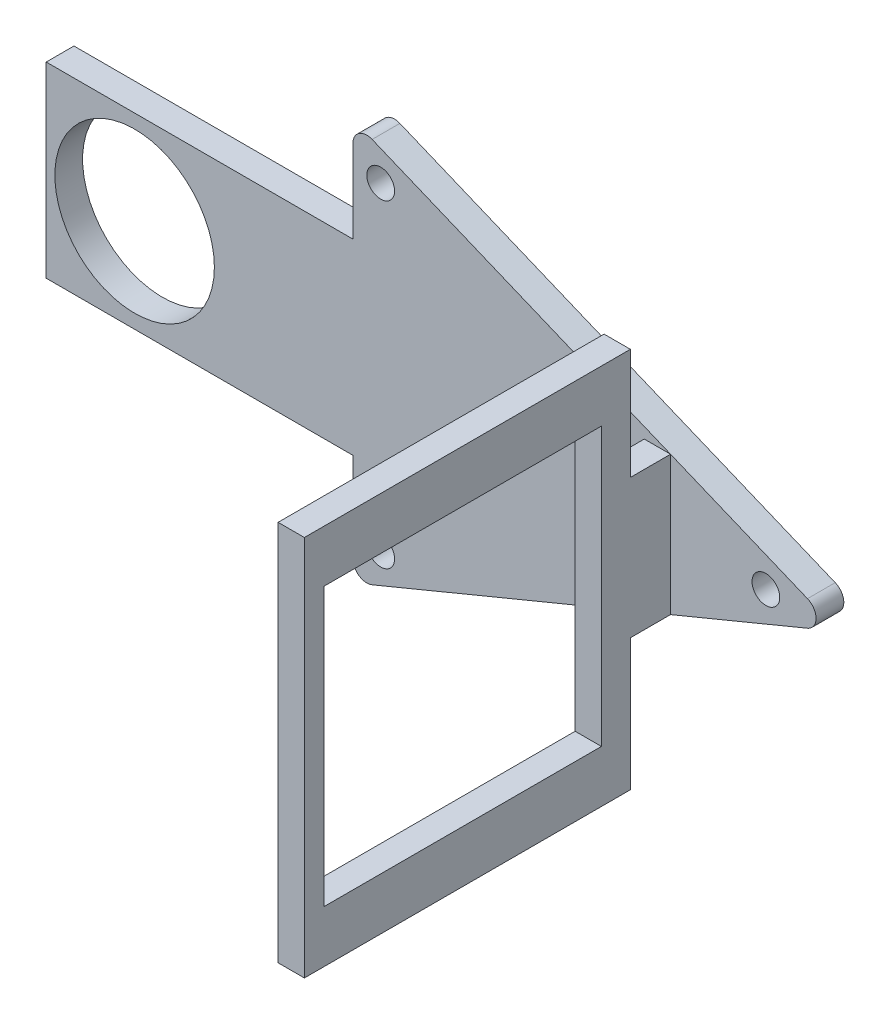
ISO-10303-21;
HEADER;
FILE_DESCRIPTION(('STEP AP214'),'2;1');
FILE_NAME('part.step','',(''),(''),'','','');
FILE_SCHEMA(('AUTOMOTIVE_DESIGN { 1 0 10303 214 1 1 1 1 }'));
ENDSEC;
DATA;
#1=APPLICATION_CONTEXT('core data for automotive mechanical design processes');
#2=APPLICATION_PROTOCOL_DEFINITION('international standard','automotive_design',2000,#1);
#3=PRODUCT_CONTEXT('',#1,'mechanical');
#4=PRODUCT('Part','Part','',(#3));
#5=PRODUCT_RELATED_PRODUCT_CATEGORY('part','',(#4));
#6=PRODUCT_DEFINITION_FORMATION('','',#4);
#7=PRODUCT_DEFINITION_CONTEXT('part definition',#1,'design');
#8=PRODUCT_DEFINITION('design','',#6,#7);
#9=PRODUCT_DEFINITION_SHAPE('','',#8);
#10=(LENGTH_UNIT() NAMED_UNIT(*) SI_UNIT(.MILLI.,.METRE.));
#11=(NAMED_UNIT(*) PLANE_ANGLE_UNIT() SI_UNIT($,.RADIAN.));
#12=(NAMED_UNIT(*) SI_UNIT($,.STERADIAN.) SOLID_ANGLE_UNIT());
#13=UNCERTAINTY_MEASURE_WITH_UNIT(LENGTH_MEASURE(1.E-05),#10,'distance_accuracy_value','');
#14=(GEOMETRIC_REPRESENTATION_CONTEXT(3) GLOBAL_UNCERTAINTY_ASSIGNED_CONTEXT((#13)) GLOBAL_UNIT_ASSIGNED_CONTEXT((#10,
#11,#12)) REPRESENTATION_CONTEXT('',''));
#15=CARTESIAN_POINT('',(0.,0.,0.));
#16=DIRECTION('',(0.,0.,1.));
#17=DIRECTION('',(1.,0.,0.));
#18=AXIS2_PLACEMENT_3D('',#15,#16,#17);
#19=CARTESIAN_POINT('',(14.8531855955679,-10.0113976186966,-0.002000000000002));
#20=DIRECTION('',(0.,-1.,0.));
#21=DIRECTION('',(0.,0.,-1.));
#22=AXIS2_PLACEMENT_3D('',#19,#20,#21);
#23=PLANE('',#22);
#24=DIRECTION('',(0.,0.,1.));
#25=VECTOR('',#24,1.);
#26=CARTESIAN_POINT('',(18.6438058994469,-10.0113976186966,-0.002000000000002));
#27=LINE('',#26,#25);
#28=CARTESIAN_POINT('',(18.6438058994469,-10.0113976186966,4.));
#29=VERTEX_POINT('',#28);
#30=CARTESIAN_POINT('',(18.6438058994469,-10.0113976186966,9.79265388740694));
#31=VERTEX_POINT('',#30);
#32=EDGE_CURVE('E258',#29,#31,#27,.T.);
#33=ORIENTED_EDGE('',*,*,#32,.T.);
#34=DIRECTION('',(1.,0.,0.));
#35=VECTOR('',#34,1.);
#36=CARTESIAN_POINT('',(18.6438058994469,-10.0113976186966,9.79265388740694));
#37=LINE('',#36,#35);
#38=CARTESIAN_POINT('',(14.8531855955679,-10.0113976186966,9.79265388740694));
#39=VERTEX_POINT('',#38);
#40=EDGE_CURVE('E207',#39,#31,#37,.T.);
#41=ORIENTED_EDGE('',*,*,#40,.F.);
#42=DIRECTION('',(0.,0.,1.));
#43=VECTOR('',#42,1.);
#44=CARTESIAN_POINT('',(14.8531855955679,-10.0113976186966,-0.002000000000002));
#45=LINE('',#44,#43);
#46=CARTESIAN_POINT('',(14.8531855955679,-10.0113976186966,4.));
#47=VERTEX_POINT('',#46);
#48=EDGE_CURVE('E250',#47,#39,#45,.T.);
#49=ORIENTED_EDGE('',*,*,#48,.F.);
#50=DIRECTION('',(-1.,0.,0.));
#51=VECTOR('',#50,1.);
#52=CARTESIAN_POINT('',(14.8531855955679,-10.0113976186966,4.));
#53=LINE('',#52,#51);
#54=EDGE_CURVE('E261',#29,#47,#53,.T.);
#55=ORIENTED_EDGE('',*,*,#54,.F.);
#56=EDGE_LOOP('',(#33,#41,#49,#55));
#57=FACE_BOUND('',#56,.T.);
#58=ADVANCED_FACE('F33',(#57),#23,.T.);
#59=CARTESIAN_POINT('',(18.6438058994469,10.0113976186967,-0.002000000000002));
#60=DIRECTION('',(0.,1.,0.));
#61=DIRECTION('',(0.,0.,1.));
#62=AXIS2_PLACEMENT_3D('',#59,#60,#61);
#63=PLANE('',#62);
#64=DIRECTION('',(0.,0.,1.));
#65=VECTOR('',#64,1.);
#66=CARTESIAN_POINT('',(14.8531855955679,10.0113976186967,-0.002000000000002));
#67=LINE('',#66,#65);
#68=CARTESIAN_POINT('',(14.8531855955679,10.0113976186967,4.));
#69=VERTEX_POINT('',#68);
#70=CARTESIAN_POINT('',(14.8531855955679,10.0113976186967,9.79265388740693));
#71=VERTEX_POINT('',#70);
#72=EDGE_CURVE('E253',#69,#71,#67,.T.);
#73=ORIENTED_EDGE('',*,*,#72,.T.);
#74=DIRECTION('',(-1.,0.,0.));
#75=VECTOR('',#74,1.);
#76=CARTESIAN_POINT('',(14.8531855955679,10.0113976186967,9.79265388740693));
#77=LINE('',#76,#75);
#78=CARTESIAN_POINT('',(18.6438058994469,10.0113976186967,9.79265388740693));
#79=VERTEX_POINT('',#78);
#80=EDGE_CURVE('E227',#79,#71,#77,.T.);
#81=ORIENTED_EDGE('',*,*,#80,.F.);
#82=DIRECTION('',(0.,0.,1.));
#83=VECTOR('',#82,1.);
#84=CARTESIAN_POINT('',(18.6438058994469,10.0113976186967,-0.002000000000002));
#85=LINE('',#84,#83);
#86=CARTESIAN_POINT('',(18.6438058994469,10.0113976186967,4.));
#87=VERTEX_POINT('',#86);
#88=EDGE_CURVE('E255',#87,#79,#85,.T.);
#89=ORIENTED_EDGE('',*,*,#88,.F.);
#90=DIRECTION('',(1.,0.,0.));
#91=VECTOR('',#90,1.);
#92=CARTESIAN_POINT('',(18.6438058994469,10.0113976186967,4.));
#93=LINE('',#92,#91);
#94=EDGE_CURVE('E266',#69,#87,#93,.T.);
#95=ORIENTED_EDGE('',*,*,#94,.F.);
#96=EDGE_LOOP('',(#73,#81,#89,#95));
#97=FACE_BOUND('',#96,.T.);
#98=ADVANCED_FACE('F460',(#97),#63,.T.);
#99=CARTESIAN_POINT('',(-25.1468144044321,25.9560362279846,4.));
#100=DIRECTION('',(0.,0.,1.));
#101=DIRECTION('',(1.,0.,0.));
#102=AXIS2_PLACEMENT_3D('',#99,#100,#101);
#103=PLANE('',#102);
#104=CARTESIAN_POINT('',(-23.1468144044321,-22.9647040349165,4.));
#105=DIRECTION('',(0.,0.,1.));
#106=DIRECTION('',(1.,0.,0.));
#107=AXIS2_PLACEMENT_3D('',#104,#105,#106);
#108=CIRCLE('',#107,1.99999999999998);
#109=CARTESIAN_POINT('',(-21.1468144044322,-22.9647040349165,4.));
#110=VERTEX_POINT('',#109);
#111=EDGE_CURVE('E381',#110,#110,#108,.T.);
#112=ORIENTED_EDGE('',*,*,#111,.F.);
#113=EDGE_LOOP('',(#112));
#114=FACE_BOUND('',#113,.T.);
#115=CARTESIAN_POINT('',(-23.1468144044321,22.9647040349165,4.));
#116=DIRECTION('',(0.,0.,1.));
#117=DIRECTION('',(1.,0.,0.));
#118=AXIS2_PLACEMENT_3D('',#115,#116,#117);
#119=CIRCLE('',#118,1.99999999999998);
#120=CARTESIAN_POINT('',(-21.1468144044322,22.9647040349165,4.));
#121=VERTEX_POINT('',#120);
#122=EDGE_CURVE('E375',#121,#121,#119,.T.);
#123=ORIENTED_EDGE('',*,*,#122,.F.);
#124=EDGE_LOOP('',(#123));
#125=FACE_BOUND('',#124,.T.);
#126=CARTESIAN_POINT('',(-58.625359309383,0.476036227984549,4.));
#127=DIRECTION('',(0.,0.,1.));
#128=DIRECTION('',(1.,0.,0.));
#129=AXIS2_PLACEMENT_3D('',#126,#127,#128);
#130=CIRCLE('',#129,11.5);
#131=CARTESIAN_POINT('',(-47.125359309383,0.476036227984549,4.));
#132=VERTEX_POINT('',#131);
#133=EDGE_CURVE('E364',#132,#132,#130,.T.);
#134=ORIENTED_EDGE('',*,*,#133,.F.);
#135=EDGE_LOOP('',(#134));
#136=FACE_BOUND('',#135,.T.);
#137=DIRECTION('',(0.92410145706241,0.382147219085959,0.));
#138=VECTOR('',#137,1.);
#139=CARTESIAN_POINT('',(-24.3825199662603,-27.8042391421093,4.));
#140=LINE('',#139,#138);
#141=CARTESIAN_POINT('',(-24.3825199662602,-27.8042391421094,4.));
#142=VERTEX_POINT('',#141);
#143=EDGE_CURVE('E328',#142,#29,#140,.T.);
#144=ORIENTED_EDGE('',*,*,#143,.T.);
#145=ORIENTED_EDGE('',*,*,#54,.T.);
#146=DIRECTION('',(0.,1.,0.));
#147=VECTOR('',#146,1.);
#148=CARTESIAN_POINT('',(14.8531855955679,10.0113976186967,4.));
#149=LINE('',#148,#147);
#150=EDGE_CURVE('E262',#47,#69,#149,.T.);
#151=ORIENTED_EDGE('',*,*,#150,.T.);
#152=ORIENTED_EDGE('',*,*,#94,.T.);
#153=DIRECTION('',(-0.92410145706241,0.382147219085958,0.));
#154=VECTOR('',#153,1.);
#155=CARTESIAN_POINT('',(38.3838949123206,1.84820291412484,4.));
#156=LINE('',#155,#154);
#157=CARTESIAN_POINT('',(-24.3825199662603,27.8042391421093,4.));
#158=VERTEX_POINT('',#157);
#159=EDGE_CURVE('E334',#87,#158,#156,.T.);
#160=ORIENTED_EDGE('',*,*,#159,.T.);
#161=CARTESIAN_POINT('',(-25.1468144044321,25.9560362279846,4.));
#162=DIRECTION('',(0.,0.,1.));
#163=DIRECTION('',(1.,0.,0.));
#164=AXIS2_PLACEMENT_3D('',#161,#162,#163);
#165=CIRCLE('',#164,1.99999999999999);
#166=CARTESIAN_POINT('',(-27.1468144044321,25.9560362279846,4.));
#167=VERTEX_POINT('',#166);
#168=EDGE_CURVE('E296',#158,#167,#165,.T.);
#169=ORIENTED_EDGE('',*,*,#168,.T.);
#170=DIRECTION('',(0.,-1.,0.));
#171=VECTOR('',#170,1.);
#172=CARTESIAN_POINT('',(-27.1468144044321,25.9560362279846,4.));
#173=LINE('',#172,#171);
#174=CARTESIAN_POINT('',(-27.1468144044321,13.9760362279845,4.));
#175=VERTEX_POINT('',#174);
#176=EDGE_CURVE('E321',#167,#175,#173,.T.);
#177=ORIENTED_EDGE('',*,*,#176,.T.);
#178=DIRECTION('',(1.,0.,0.));
#179=VECTOR('',#178,1.);
#180=CARTESIAN_POINT('',(-71.3681981861213,13.9760362279845,4.));
#181=LINE('',#180,#179);
#182=CARTESIAN_POINT('',(-71.3681981861213,13.9760362279845,4.));
#183=VERTEX_POINT('',#182);
#184=EDGE_CURVE('E284',#183,#175,#181,.T.);
#185=ORIENTED_EDGE('',*,*,#184,.F.);
#186=DIRECTION('',(0.,1.,0.));
#187=VECTOR('',#186,1.);
#188=CARTESIAN_POINT('',(-71.3681981861213,13.9760362279845,4.));
#189=LINE('',#188,#187);
#190=CARTESIAN_POINT('',(-71.3681981861213,-13.0239637720154,4.));
#191=VERTEX_POINT('',#190);
#192=EDGE_CURVE('E282',#191,#183,#189,.T.);
#193=ORIENTED_EDGE('',*,*,#192,.F.);
#194=DIRECTION('',(1.,0.,0.));
#195=VECTOR('',#194,1.);
#196=CARTESIAN_POINT('',(-71.3681981861213,-13.0239637720154,4.));
#197=LINE('',#196,#195);
#198=CARTESIAN_POINT('',(-27.1468144044321,-13.0239637720154,4.));
#199=VERTEX_POINT('',#198);
#200=EDGE_CURVE('E290',#191,#199,#197,.T.);
#201=ORIENTED_EDGE('',*,*,#200,.T.);
#202=CARTESIAN_POINT('',(-27.1468144044321,-25.9560362279846,4.));
#203=VERTEX_POINT('',#202);
#204=EDGE_CURVE('E320',#199,#203,#173,.T.);
#205=ORIENTED_EDGE('',*,*,#204,.T.);
#206=CARTESIAN_POINT('',(-25.1468144044321,-25.9560362279846,4.));
#207=DIRECTION('',(0.,0.,1.));
#208=DIRECTION('',(1.,0.,0.));
#209=AXIS2_PLACEMENT_3D('',#206,#207,#208);
#210=CIRCLE('',#209,1.99999999999999);
#211=EDGE_CURVE('E324',#203,#142,#210,.T.);
#212=ORIENTED_EDGE('',*,*,#211,.T.);
#213=EDGE_LOOP('',(#144,#145,#151,#152,#160,#169,#177,#185,#193,#201,#205,#212));
#214=FACE_BOUND('',#213,.T.);
#215=ADVANCED_FACE('F446',(#114,#125,#136,#214),#103,.T.);
#216=CARTESIAN_POINT('',(32.3860153527295,0.,4.));
#217=DIRECTION('',(0.,0.,1.));
#218=DIRECTION('',(1.,0.,0.));
#219=AXIS2_PLACEMENT_3D('',#216,#217,#218);
#220=CIRCLE('',#219,1.99999999999998);
#221=CARTESIAN_POINT('',(34.3860153527294,0.,4.));
#222=VERTEX_POINT('',#221);
#223=EDGE_CURVE('E369',#222,#222,#220,.T.);
#224=ORIENTED_EDGE('',*,*,#223,.F.);
#225=EDGE_LOOP('',(#224));
#226=FACE_BOUND('',#225,.T.);
#227=CARTESIAN_POINT('',(38.3838949123206,1.84820291412483,4.));
#228=VERTEX_POINT('',#227);
#229=EDGE_CURVE('E301',#228,#87,#156,.T.);
#230=ORIENTED_EDGE('',*,*,#229,.T.);
#231=DIRECTION('',(0.,-1.,0.));
#232=VECTOR('',#231,1.);
#233=CARTESIAN_POINT('',(18.6438058994469,-10.0113976186966,4.));
#234=LINE('',#233,#232);
#235=EDGE_CURVE('E269',#87,#29,#234,.T.);
#236=ORIENTED_EDGE('',*,*,#235,.T.);
#237=CARTESIAN_POINT('',(38.3838949123206,-1.84820291412479,4.));
#238=VERTEX_POINT('',#237);
#239=EDGE_CURVE('E327',#29,#238,#140,.T.);
#240=ORIENTED_EDGE('',*,*,#239,.T.);
#241=CARTESIAN_POINT('',(37.6196004741487,0.,4.));
#242=DIRECTION('',(0.,0.,1.));
#243=DIRECTION('',(1.,0.,0.));
#244=AXIS2_PLACEMENT_3D('',#241,#242,#243);
#245=CIRCLE('',#244,2.00000000000001);
#246=EDGE_CURVE('E331',#238,#228,#245,.T.);
#247=ORIENTED_EDGE('',*,*,#246,.T.);
#248=EDGE_LOOP('',(#230,#236,#240,#247));
#249=FACE_BOUND('',#248,.T.);
#250=ADVANCED_FACE('F448',(#226,#249),#103,.T.);
#251=CARTESIAN_POINT('',(-27.1468144044321,25.9560362279846,0.));
#252=DIRECTION('',(-1.,0.,0.));
#253=DIRECTION('',(0.,0.,1.));
#254=AXIS2_PLACEMENT_3D('',#251,#252,#253);
#255=PLANE('',#254);
#256=DIRECTION('',(0.,-1.,0.));
#257=VECTOR('',#256,1.);
#258=CARTESIAN_POINT('',(-27.1468144044321,25.9560362279846,0.));
#259=LINE('',#258,#257);
#260=CARTESIAN_POINT('',(-27.1468144044321,25.9560362279846,0.));
#261=VERTEX_POINT('',#260);
#262=CARTESIAN_POINT('',(-27.1468144044321,13.9760362279845,0.));
#263=VERTEX_POINT('',#262);
#264=EDGE_CURVE('E302',#261,#263,#259,.T.);
#265=ORIENTED_EDGE('',*,*,#264,.T.);
#266=DIRECTION('',(0.,0.,-1.));
#267=VECTOR('',#266,1.);
#268=CARTESIAN_POINT('',(-27.1468144044321,13.9760362279845,0.));
#269=LINE('',#268,#267);
#270=EDGE_CURVE('E265',#175,#263,#269,.T.);
#271=ORIENTED_EDGE('',*,*,#270,.F.);
#272=ORIENTED_EDGE('',*,*,#176,.F.);
#273=DIRECTION('',(0.,0.,1.));
#274=VECTOR('',#273,1.);
#275=CARTESIAN_POINT('',(-27.1468144044321,25.9560362279846,0.));
#276=LINE('',#275,#274);
#277=EDGE_CURVE('E317',#261,#167,#276,.T.);
#278=ORIENTED_EDGE('',*,*,#277,.F.);
#279=EDGE_LOOP('',(#265,#271,#272,#278));
#280=FACE_BOUND('',#279,.T.);
#281=ADVANCED_FACE('F444',(#280),#255,.T.);
#282=ORIENTED_EDGE('',*,*,#204,.F.);
#283=DIRECTION('',(0.,0.,1.));
#284=VECTOR('',#283,1.);
#285=CARTESIAN_POINT('',(-27.1468144044321,-13.0239637720154,4.));
#286=LINE('',#285,#284);
#287=CARTESIAN_POINT('',(-27.1468144044321,-13.0239637720154,0.));
#288=VERTEX_POINT('',#287);
#289=EDGE_CURVE('E278',#288,#199,#286,.T.);
#290=ORIENTED_EDGE('',*,*,#289,.F.);
#291=CARTESIAN_POINT('',(-27.1468144044321,-25.9560362279846,0.));
#292=VERTEX_POINT('',#291);
#293=EDGE_CURVE('E300',#288,#292,#259,.T.);
#294=ORIENTED_EDGE('',*,*,#293,.T.);
#295=DIRECTION('',(0.,0.,1.));
#296=VECTOR('',#295,1.);
#297=CARTESIAN_POINT('',(-27.1468144044321,-25.9560362279846,0.));
#298=LINE('',#297,#296);
#299=EDGE_CURVE('E348',#292,#203,#298,.T.);
#300=ORIENTED_EDGE('',*,*,#299,.T.);
#301=EDGE_LOOP('',(#282,#290,#294,#300));
#302=FACE_BOUND('',#301,.T.);
#303=ADVANCED_FACE('F430',(#302),#255,.T.);
#304=CARTESIAN_POINT('',(-25.1468144044321,25.9560362279846,0.));
#305=DIRECTION('',(0.,0.,1.));
#306=DIRECTION('',(1.,0.,0.));
#307=AXIS2_PLACEMENT_3D('',#304,#305,#306);
#308=CYLINDRICAL_SURFACE('',#307,1.99999999999999);
#309=ORIENTED_EDGE('',*,*,#168,.F.);
#310=DIRECTION('',(0.,0.,1.));
#311=VECTOR('',#310,1.);
#312=CARTESIAN_POINT('',(-24.3825199662603,27.8042391421093,0.));
#313=LINE('',#312,#311);
#314=CARTESIAN_POINT('',(-24.3825199662603,27.8042391421093,0.));
#315=VERTEX_POINT('',#314);
#316=EDGE_CURVE('E337',#315,#158,#313,.T.);
#317=ORIENTED_EDGE('',*,*,#316,.F.);
#318=CARTESIAN_POINT('',(-25.1468144044321,25.9560362279846,0.));
#319=DIRECTION('',(0.,0.,1.));
#320=DIRECTION('',(1.,0.,0.));
#321=AXIS2_PLACEMENT_3D('',#318,#319,#320);
#322=CIRCLE('',#321,1.99999999999999);
#323=EDGE_CURVE('E297',#315,#261,#322,.T.);
#324=ORIENTED_EDGE('',*,*,#323,.T.);
#325=ORIENTED_EDGE('',*,*,#277,.T.);
#326=EDGE_LOOP('',(#309,#317,#324,#325));
#327=FACE_BOUND('',#326,.T.);
#328=ADVANCED_FACE('F35',(#327),#308,.T.);
#329=CARTESIAN_POINT('',(38.3838949123206,1.84820291412484,0.));
#330=DIRECTION('',(0.382147219085958,0.92410145706241,0.));
#331=DIRECTION('',(-0.92410145706241,0.382147219085958,0.));
#332=AXIS2_PLACEMENT_3D('',#329,#330,#331);
#333=PLANE('',#332);
#334=ORIENTED_EDGE('',*,*,#229,.F.);
#335=DIRECTION('',(0.,0.,1.));
#336=VECTOR('',#335,1.);
#337=CARTESIAN_POINT('',(38.3838949123206,1.84820291412483,0.));
#338=LINE('',#337,#336);
#339=CARTESIAN_POINT('',(38.3838949123206,1.84820291412483,0.));
#340=VERTEX_POINT('',#339);
#341=EDGE_CURVE('E341',#340,#228,#338,.T.);
#342=ORIENTED_EDGE('',*,*,#341,.F.);
#343=DIRECTION('',(-0.92410145706241,0.382147219085958,0.));
#344=VECTOR('',#343,1.);
#345=CARTESIAN_POINT('',(38.3838949123206,1.84820291412484,0.));
#346=LINE('',#345,#344);
#347=EDGE_CURVE('E314',#340,#315,#346,.T.);
#348=ORIENTED_EDGE('',*,*,#347,.T.);
#349=ORIENTED_EDGE('',*,*,#316,.T.);
#350=ORIENTED_EDGE('',*,*,#159,.F.);
#351=EDGE_LOOP('',(#334,#342,#348,#349,#350));
#352=FACE_BOUND('',#351,.T.);
#353=ADVANCED_FACE('F409',(#352),#333,.T.);
#354=CARTESIAN_POINT('',(37.6196004741487,0.,0.));
#355=DIRECTION('',(0.,0.,1.));
#356=DIRECTION('',(1.,0.,0.));
#357=AXIS2_PLACEMENT_3D('',#354,#355,#356);
#358=CYLINDRICAL_SURFACE('',#357,2.00000000000001);
#359=ORIENTED_EDGE('',*,*,#246,.F.);
#360=DIRECTION('',(0.,0.,1.));
#361=VECTOR('',#360,1.);
#362=CARTESIAN_POINT('',(38.3838949123206,-1.84820291412479,0.));
#363=LINE('',#362,#361);
#364=CARTESIAN_POINT('',(38.3838949123206,-1.84820291412479,0.));
#365=VERTEX_POINT('',#364);
#366=EDGE_CURVE('E343',#365,#238,#363,.T.);
#367=ORIENTED_EDGE('',*,*,#366,.F.);
#368=CARTESIAN_POINT('',(37.6196004741487,0.,0.));
#369=DIRECTION('',(0.,0.,1.));
#370=DIRECTION('',(1.,0.,0.));
#371=AXIS2_PLACEMENT_3D('',#368,#369,#370);
#372=CIRCLE('',#371,2.00000000000001);
#373=EDGE_CURVE('E311',#365,#340,#372,.T.);
#374=ORIENTED_EDGE('',*,*,#373,.T.);
#375=ORIENTED_EDGE('',*,*,#341,.T.);
#376=EDGE_LOOP('',(#359,#367,#374,#375));
#377=FACE_BOUND('',#376,.T.);
#378=ADVANCED_FACE('F414',(#377),#358,.T.);
#379=CARTESIAN_POINT('',(-24.3825199662603,-27.8042391421093,0.));
#380=DIRECTION('',(0.382147219085959,-0.92410145706241,0.));
#381=DIRECTION('',(0.92410145706241,0.382147219085959,0.));
#382=AXIS2_PLACEMENT_3D('',#379,#380,#381);
#383=PLANE('',#382);
#384=ORIENTED_EDGE('',*,*,#143,.F.);
#385=DIRECTION('',(0.,0.,1.));
#386=VECTOR('',#385,1.);
#387=CARTESIAN_POINT('',(-24.3825199662602,-27.8042391421094,0.));
#388=LINE('',#387,#386);
#389=CARTESIAN_POINT('',(-24.3825199662602,-27.8042391421094,0.));
#390=VERTEX_POINT('',#389);
#391=EDGE_CURVE('E346',#390,#142,#388,.T.);
#392=ORIENTED_EDGE('',*,*,#391,.F.);
#393=DIRECTION('',(0.92410145706241,0.382147219085959,0.));
#394=VECTOR('',#393,1.);
#395=CARTESIAN_POINT('',(-24.3825199662603,-27.8042391421093,0.));
#396=LINE('',#395,#394);
#397=EDGE_CURVE('E308',#390,#365,#396,.T.);
#398=ORIENTED_EDGE('',*,*,#397,.T.);
#399=ORIENTED_EDGE('',*,*,#366,.T.);
#400=ORIENTED_EDGE('',*,*,#239,.F.);
#401=EDGE_LOOP('',(#384,#392,#398,#399,#400));
#402=FACE_BOUND('',#401,.T.);
#403=ADVANCED_FACE('F419',(#402),#383,.T.);
#404=CARTESIAN_POINT('',(-25.1468144044321,-25.9560362279846,0.));
#405=DIRECTION('',(0.,0.,1.));
#406=DIRECTION('',(1.,0.,0.));
#407=AXIS2_PLACEMENT_3D('',#404,#405,#406);
#408=CYLINDRICAL_SURFACE('',#407,1.99999999999999);
#409=ORIENTED_EDGE('',*,*,#211,.F.);
#410=ORIENTED_EDGE('',*,*,#299,.F.);
#411=CARTESIAN_POINT('',(-25.1468144044321,-25.9560362279846,0.));
#412=DIRECTION('',(0.,0.,1.));
#413=DIRECTION('',(1.,0.,0.));
#414=AXIS2_PLACEMENT_3D('',#411,#412,#413);
#415=CIRCLE('',#414,1.99999999999999);
#416=EDGE_CURVE('E305',#292,#390,#415,.T.);
#417=ORIENTED_EDGE('',*,*,#416,.T.);
#418=ORIENTED_EDGE('',*,*,#391,.T.);
#419=EDGE_LOOP('',(#409,#410,#417,#418));
#420=FACE_BOUND('',#419,.T.);
#421=ADVANCED_FACE('F394',(#420),#408,.T.);
#422=CARTESIAN_POINT('',(-25.1468144044321,25.9560362279846,0.));
#423=DIRECTION('',(0.,0.,1.));
#424=DIRECTION('',(1.,0.,0.));
#425=AXIS2_PLACEMENT_3D('',#422,#423,#424);
#426=PLANE('',#425);
#427=CARTESIAN_POINT('',(-23.1468144044321,-22.9647040349165,0.));
#428=DIRECTION('',(0.,0.,-1.));
#429=DIRECTION('',(-1.,0.,0.));
#430=AXIS2_PLACEMENT_3D('',#427,#428,#429);
#431=CIRCLE('',#430,1.99999999999999);
#432=CARTESIAN_POINT('',(-25.1468144044321,-22.9647040349165,0.));
#433=VERTEX_POINT('',#432);
#434=EDGE_CURVE('E384',#433,#433,#431,.T.);
#435=ORIENTED_EDGE('',*,*,#434,.F.);
#436=EDGE_LOOP('',(#435));
#437=FACE_BOUND('',#436,.T.);
#438=CARTESIAN_POINT('',(-23.1468144044321,22.9647040349165,0.));
#439=DIRECTION('',(0.,0.,-1.));
#440=DIRECTION('',(-1.,0.,0.));
#441=AXIS2_PLACEMENT_3D('',#438,#439,#440);
#442=CIRCLE('',#441,1.99999999999999);
#443=CARTESIAN_POINT('',(-25.1468144044321,22.9647040349165,0.));
#444=VERTEX_POINT('',#443);
#445=EDGE_CURVE('E378',#444,#444,#442,.T.);
#446=ORIENTED_EDGE('',*,*,#445,.F.);
#447=EDGE_LOOP('',(#446));
#448=FACE_BOUND('',#447,.T.);
#449=CARTESIAN_POINT('',(32.3860153527295,0.,0.));
#450=DIRECTION('',(0.,0.,-1.));
#451=DIRECTION('',(-1.,0.,0.));
#452=AXIS2_PLACEMENT_3D('',#449,#450,#451);
#453=CIRCLE('',#452,1.99999999999999);
#454=CARTESIAN_POINT('',(30.3860153527295,0.,0.));
#455=VERTEX_POINT('',#454);
#456=EDGE_CURVE('E372',#455,#455,#453,.T.);
#457=ORIENTED_EDGE('',*,*,#456,.F.);
#458=EDGE_LOOP('',(#457));
#459=FACE_BOUND('',#458,.T.);
#460=CARTESIAN_POINT('',(-58.625359309383,0.476036227984549,0.));
#461=DIRECTION('',(0.,0.,1.));
#462=DIRECTION('',(1.,0.,0.));
#463=AXIS2_PLACEMENT_3D('',#460,#461,#462);
#464=CIRCLE('',#463,11.5);
#465=CARTESIAN_POINT('',(-47.125359309383,0.476036227984549,0.));
#466=VERTEX_POINT('',#465);
#467=EDGE_CURVE('E362',#466,#466,#464,.T.);
#468=ORIENTED_EDGE('',*,*,#467,.T.);
#469=EDGE_LOOP('',(#468));
#470=FACE_BOUND('',#469,.T.);
#471=ORIENTED_EDGE('',*,*,#323,.F.);
#472=ORIENTED_EDGE('',*,*,#347,.F.);
#473=ORIENTED_EDGE('',*,*,#373,.F.);
#474=ORIENTED_EDGE('',*,*,#397,.F.);
#475=ORIENTED_EDGE('',*,*,#416,.F.);
#476=ORIENTED_EDGE('',*,*,#293,.F.);
#477=DIRECTION('',(1.,0.,0.));
#478=VECTOR('',#477,1.);
#479=CARTESIAN_POINT('',(-71.3681981861213,-13.0239637720154,0.));
#480=LINE('',#479,#478);
#481=CARTESIAN_POINT('',(-71.3681981861213,-13.0239637720154,0.));
#482=VERTEX_POINT('',#481);
#483=EDGE_CURVE('E292',#482,#288,#480,.T.);
#484=ORIENTED_EDGE('',*,*,#483,.F.);
#485=DIRECTION('',(0.,-1.,0.));
#486=VECTOR('',#485,1.);
#487=CARTESIAN_POINT('',(-71.3681981861213,-13.0239637720154,0.));
#488=LINE('',#487,#486);
#489=CARTESIAN_POINT('',(-71.3681981861213,13.9760362279845,0.));
#490=VERTEX_POINT('',#489);
#491=EDGE_CURVE('E277',#490,#482,#488,.T.);
#492=ORIENTED_EDGE('',*,*,#491,.F.);
#493=DIRECTION('',(1.,0.,0.));
#494=VECTOR('',#493,1.);
#495=CARTESIAN_POINT('',(-71.3681981861213,13.9760362279845,0.));
#496=LINE('',#495,#494);
#497=EDGE_CURVE('E294',#490,#263,#496,.T.);
#498=ORIENTED_EDGE('',*,*,#497,.T.);
#499=ORIENTED_EDGE('',*,*,#264,.F.);
#500=EDGE_LOOP('',(#471,#472,#473,#474,#475,#476,#484,#492,#498,#499));
#501=FACE_BOUND('',#500,.T.);
#502=ADVANCED_FACE('F390',(#437,#448,#459,#470,#501),#426,.F.);
#503=CARTESIAN_POINT('',(-71.3681981861213,13.9760362279845,0.));
#504=DIRECTION('',(0.,-1.,0.));
#505=DIRECTION('',(0.,0.,-1.));
#506=AXIS2_PLACEMENT_3D('',#503,#504,#505);
#507=PLANE('',#506);
#508=ORIENTED_EDGE('',*,*,#270,.T.);
#509=ORIENTED_EDGE('',*,*,#497,.F.);
#510=DIRECTION('',(0.,0.,-1.));
#511=VECTOR('',#510,1.);
#512=CARTESIAN_POINT('',(-71.3681981861213,13.9760362279845,0.));
#513=LINE('',#512,#511);
#514=EDGE_CURVE('E274',#183,#490,#513,.T.);
#515=ORIENTED_EDGE('',*,*,#514,.F.);
#516=ORIENTED_EDGE('',*,*,#184,.T.);
#517=EDGE_LOOP('',(#508,#509,#515,#516));
#518=FACE_BOUND('',#517,.T.);
#519=ADVANCED_FACE('F393',(#518),#507,.F.);
#520=CARTESIAN_POINT('',(-71.3681981861213,-13.0239637720154,4.));
#521=DIRECTION('',(0.,1.,0.));
#522=DIRECTION('',(0.,0.,1.));
#523=AXIS2_PLACEMENT_3D('',#520,#521,#522);
#524=PLANE('',#523);
#525=ORIENTED_EDGE('',*,*,#289,.T.);
#526=ORIENTED_EDGE('',*,*,#200,.F.);
#527=DIRECTION('',(0.,0.,1.));
#528=VECTOR('',#527,1.);
#529=CARTESIAN_POINT('',(-71.3681981861213,-13.0239637720154,4.));
#530=LINE('',#529,#528);
#531=EDGE_CURVE('E280',#482,#191,#530,.T.);
#532=ORIENTED_EDGE('',*,*,#531,.F.);
#533=ORIENTED_EDGE('',*,*,#483,.T.);
#534=EDGE_LOOP('',(#525,#526,#532,#533));
#535=FACE_BOUND('',#534,.T.);
#536=ADVANCED_FACE('F433',(#535),#524,.F.);
#537=CARTESIAN_POINT('',(-71.3681981861213,0.,0.));
#538=DIRECTION('',(1.,0.,0.));
#539=DIRECTION('',(0.,0.,-1.));
#540=AXIS2_PLACEMENT_3D('',#537,#538,#539);
#541=PLANE('',#540);
#542=ORIENTED_EDGE('',*,*,#514,.T.);
#543=ORIENTED_EDGE('',*,*,#491,.T.);
#544=ORIENTED_EDGE('',*,*,#531,.T.);
#545=ORIENTED_EDGE('',*,*,#192,.T.);
#546=EDGE_LOOP('',(#542,#543,#544,#545));
#547=FACE_BOUND('',#546,.T.);
#548=ADVANCED_FACE('F436',(#547),#541,.F.);
#549=CARTESIAN_POINT('',(18.6438058994469,-10.0113976186966,-0.002000000000002));
#550=DIRECTION('',(1.,0.,0.));
#551=DIRECTION('',(0.,0.,-1.));
#552=AXIS2_PLACEMENT_3D('',#549,#550,#551);
#553=PLANE('',#552);
#554=DIRECTION('',(0.,0.,1.));
#555=VECTOR('',#554,1.);
#556=CARTESIAN_POINT('',(18.6438058994469,18.5113976186967,13.9686380691864));
#557=LINE('',#556,#555);
#558=CARTESIAN_POINT('',(18.6438058994469,18.5113976186967,13.9686380691864));
#559=VERTEX_POINT('',#558);
#560=CARTESIAN_POINT('',(18.6438058994469,18.5113976186967,53.9686380691865));
#561=VERTEX_POINT('',#560);
#562=EDGE_CURVE('E48',#559,#561,#557,.T.);
#563=ORIENTED_EDGE('',*,*,#562,.F.);
#564=DIRECTION('',(0.,1.,0.));
#565=VECTOR('',#564,1.);
#566=CARTESIAN_POINT('',(18.6438058994469,-21.4886023813033,13.9686380691865));
#567=LINE('',#566,#565);
#568=CARTESIAN_POINT('',(18.6438058994469,-21.4886023813033,13.9686380691865));
#569=VERTEX_POINT('',#568);
#570=EDGE_CURVE('E200',#569,#559,#567,.T.);
#571=ORIENTED_EDGE('',*,*,#570,.F.);
#572=DIRECTION('',(0.,0.,-1.));
#573=VECTOR('',#572,1.);
#574=CARTESIAN_POINT('',(18.6438058994469,-21.4886023813033,53.9686380691865));
#575=LINE('',#574,#573);
#576=CARTESIAN_POINT('',(18.6438058994469,-21.4886023813033,53.9686380691865));
#577=VERTEX_POINT('',#576);
#578=EDGE_CURVE('E184',#577,#569,#575,.T.);
#579=ORIENTED_EDGE('',*,*,#578,.F.);
#580=DIRECTION('',(0.,-1.,0.));
#581=VECTOR('',#580,1.);
#582=CARTESIAN_POINT('',(18.6438058994469,18.5113976186967,53.9686380691865));
#583=LINE('',#582,#581);
#584=EDGE_CURVE('E193',#561,#577,#583,.T.);
#585=ORIENTED_EDGE('',*,*,#584,.F.);
#586=EDGE_LOOP('',(#563,#571,#579,#585));
#587=FACE_BOUND('',#586,.T.);
#588=ORIENTED_EDGE('',*,*,#235,.F.);
#589=ORIENTED_EDGE('',*,*,#88,.T.);
#590=DIRECTION('',(0.,-1.,0.));
#591=VECTOR('',#590,1.);
#592=CARTESIAN_POINT('',(18.6438058994469,26.0113976186966,9.79265388740693));
#593=LINE('',#592,#591);
#594=CARTESIAN_POINT('',(18.6438058994469,26.0113976186966,9.79265388740693));
#595=VERTEX_POINT('',#594);
#596=EDGE_CURVE('E243',#595,#79,#593,.T.);
#597=ORIENTED_EDGE('',*,*,#596,.F.);
#598=DIRECTION('',(0.,0.,-1.));
#599=VECTOR('',#598,1.);
#600=CARTESIAN_POINT('',(18.6438058994469,26.0113976186966,9.79265388740693));
#601=LINE('',#600,#599);
#602=CARTESIAN_POINT('',(18.6438058994469,26.0113976186966,56.7926538874069));
#603=VERTEX_POINT('',#602);
#604=EDGE_CURVE('E231',#603,#595,#601,.T.);
#605=ORIENTED_EDGE('',*,*,#604,.F.);
#606=DIRECTION('',(0.,1.,0.));
#607=VECTOR('',#606,1.);
#608=CARTESIAN_POINT('',(18.6438058994469,-10.0113976186966,56.7926538874069));
#609=LINE('',#608,#607);
#610=CARTESIAN_POINT('',(18.6438058994469,-28.9886023813033,56.7926538874069));
#611=VERTEX_POINT('',#610);
#612=EDGE_CURVE('E246',#611,#603,#609,.T.);
#613=ORIENTED_EDGE('',*,*,#612,.F.);
#614=DIRECTION('',(0.,0.,1.));
#615=VECTOR('',#614,1.);
#616=CARTESIAN_POINT('',(18.6438058994469,-28.9886023813033,56.7926538874069));
#617=LINE('',#616,#615);
#618=CARTESIAN_POINT('',(18.6438058994469,-28.9886023813033,9.79265388740694));
#619=VERTEX_POINT('',#618);
#620=EDGE_CURVE('E213',#619,#611,#617,.T.);
#621=ORIENTED_EDGE('',*,*,#620,.F.);
#622=DIRECTION('',(0.,1.,0.));
#623=VECTOR('',#622,1.);
#624=CARTESIAN_POINT('',(18.6438058994469,-28.9886023813033,9.79265388740694));
#625=LINE('',#624,#623);
#626=EDGE_CURVE('E225',#619,#31,#625,.T.);
#627=ORIENTED_EDGE('',*,*,#626,.T.);
#628=ORIENTED_EDGE('',*,*,#32,.F.);
#629=EDGE_LOOP('',(#588,#589,#597,#605,#613,#621,#627,#628));
#630=FACE_BOUND('',#629,.T.);
#631=ADVANCED_FACE('F197',(#587,#630),#553,.T.);
#632=CARTESIAN_POINT('',(0.,0.,56.7926538874069));
#633=DIRECTION('',(0.,0.,1.));
#634=DIRECTION('',(1.,0.,0.));
#635=AXIS2_PLACEMENT_3D('',#632,#633,#634);
#636=PLANE('',#635);
#637=DIRECTION('',(0.,-1.,0.));
#638=VECTOR('',#637,1.);
#639=CARTESIAN_POINT('',(14.8531855955679,10.0113976186967,56.7926538874069));
#640=LINE('',#639,#638);
#641=CARTESIAN_POINT('',(14.8531855955679,26.0113976186966,56.7926538874069));
#642=VERTEX_POINT('',#641);
#643=CARTESIAN_POINT('',(14.8531855955679,-28.9886023813033,56.7926538874069));
#644=VERTEX_POINT('',#643);
#645=EDGE_CURVE('E248',#642,#644,#640,.T.);
#646=ORIENTED_EDGE('',*,*,#645,.T.);
#647=DIRECTION('',(-1.,0.,0.));
#648=VECTOR('',#647,1.);
#649=CARTESIAN_POINT('',(14.8531855955679,-28.9886023813033,56.7926538874069));
#650=LINE('',#649,#648);
#651=EDGE_CURVE('E216',#611,#644,#650,.T.);
#652=ORIENTED_EDGE('',*,*,#651,.F.);
#653=ORIENTED_EDGE('',*,*,#612,.T.);
#654=DIRECTION('',(1.,0.,0.));
#655=VECTOR('',#654,1.);
#656=CARTESIAN_POINT('',(18.6438058994469,26.0113976186966,56.7926538874069));
#657=LINE('',#656,#655);
#658=EDGE_CURVE('E228',#642,#603,#657,.T.);
#659=ORIENTED_EDGE('',*,*,#658,.F.);
#660=EDGE_LOOP('',(#646,#652,#653,#659));
#661=FACE_BOUND('',#660,.T.);
#662=ADVANCED_FACE('F477',(#661),#636,.T.);
#663=CARTESIAN_POINT('',(14.8531855955679,10.0113976186967,-0.002000000000002));
#664=DIRECTION('',(-1.,0.,0.));
#665=DIRECTION('',(0.,0.,1.));
#666=AXIS2_PLACEMENT_3D('',#663,#664,#665);
#667=PLANE('',#666);
#668=DIRECTION('',(0.,0.,-1.));
#669=VECTOR('',#668,1.);
#670=CARTESIAN_POINT('',(14.8531855955679,18.5113976186967,-0.002000000000002));
#671=LINE('',#670,#669);
#672=CARTESIAN_POINT('',(14.8531855955679,18.5113976186967,53.9686380691865));
#673=VERTEX_POINT('',#672);
#674=CARTESIAN_POINT('',(14.8531855955679,18.5113976186967,13.9686380691864));
#675=VERTEX_POINT('',#674);
#676=EDGE_CURVE('E11',#673,#675,#671,.T.);
#677=ORIENTED_EDGE('',*,*,#676,.F.);
#678=DIRECTION('',(0.,1.,0.));
#679=VECTOR('',#678,1.);
#680=CARTESIAN_POINT('',(14.8531855955679,10.0113976186967,53.9686380691865));
#681=LINE('',#680,#679);
#682=CARTESIAN_POINT('',(14.8531855955679,-21.4886023813034,53.9686380691865));
#683=VERTEX_POINT('',#682);
#684=EDGE_CURVE('E340',#683,#673,#681,.T.);
#685=ORIENTED_EDGE('',*,*,#684,.F.);
#686=DIRECTION('',(0.,0.,1.));
#687=VECTOR('',#686,1.);
#688=CARTESIAN_POINT('',(14.8531855955679,-21.4886023813034,-0.002000000000002));
#689=LINE('',#688,#687);
#690=CARTESIAN_POINT('',(14.8531855955679,-21.4886023813033,13.9686380691865));
#691=VERTEX_POINT('',#690);
#692=EDGE_CURVE('E187',#691,#683,#689,.T.);
#693=ORIENTED_EDGE('',*,*,#692,.F.);
#694=DIRECTION('',(0.,-1.,0.));
#695=VECTOR('',#694,1.);
#696=CARTESIAN_POINT('',(14.8531855955679,10.0113976186967,13.9686380691864));
#697=LINE('',#696,#695);
#698=EDGE_CURVE('E41',#675,#691,#697,.T.);
#699=ORIENTED_EDGE('',*,*,#698,.F.);
#700=EDGE_LOOP('',(#677,#685,#693,#699));
#701=FACE_BOUND('',#700,.T.);
#702=ORIENTED_EDGE('',*,*,#150,.F.);
#703=ORIENTED_EDGE('',*,*,#48,.T.);
#704=DIRECTION('',(0.,1.,0.));
#705=VECTOR('',#704,1.);
#706=CARTESIAN_POINT('',(14.8531855955679,-28.9886023813033,9.79265388740694));
#707=LINE('',#706,#705);
#708=CARTESIAN_POINT('',(14.8531855955679,-28.9886023813033,9.79265388740694));
#709=VERTEX_POINT('',#708);
#710=EDGE_CURVE('E221',#709,#39,#707,.T.);
#711=ORIENTED_EDGE('',*,*,#710,.F.);
#712=DIRECTION('',(0.,0.,-1.));
#713=VECTOR('',#712,1.);
#714=CARTESIAN_POINT('',(14.8531855955679,-28.9886023813033,9.79265388740694));
#715=LINE('',#714,#713);
#716=EDGE_CURVE('E219',#644,#709,#715,.T.);
#717=ORIENTED_EDGE('',*,*,#716,.F.);
#718=ORIENTED_EDGE('',*,*,#645,.F.);
#719=DIRECTION('',(0.,0.,1.));
#720=VECTOR('',#719,1.);
#721=CARTESIAN_POINT('',(14.8531855955679,26.0113976186966,56.7926538874069));
#722=LINE('',#721,#720);
#723=CARTESIAN_POINT('',(14.8531855955679,26.0113976186966,9.79265388740693));
#724=VERTEX_POINT('',#723);
#725=EDGE_CURVE('E235',#724,#642,#722,.T.);
#726=ORIENTED_EDGE('',*,*,#725,.F.);
#727=DIRECTION('',(0.,-1.,0.));
#728=VECTOR('',#727,1.);
#729=CARTESIAN_POINT('',(14.8531855955679,26.0113976186966,9.79265388740693));
#730=LINE('',#729,#728);
#731=EDGE_CURVE('E238',#724,#71,#730,.T.);
#732=ORIENTED_EDGE('',*,*,#731,.T.);
#733=ORIENTED_EDGE('',*,*,#72,.F.);
#734=EDGE_LOOP('',(#702,#703,#711,#717,#718,#726,#732,#733));
#735=FACE_BOUND('',#734,.T.);
#736=ADVANCED_FACE('F359',(#701,#735),#667,.T.);
#737=CARTESIAN_POINT('',(14.8531855955679,26.0113976186966,9.79265388740693));
#738=DIRECTION('',(0.,0.,1.));
#739=DIRECTION('',(1.,0.,0.));
#740=AXIS2_PLACEMENT_3D('',#737,#738,#739);
#741=PLANE('',#740);
#742=ORIENTED_EDGE('',*,*,#80,.T.);
#743=ORIENTED_EDGE('',*,*,#731,.F.);
#744=DIRECTION('',(-1.,0.,0.));
#745=VECTOR('',#744,1.);
#746=CARTESIAN_POINT('',(14.8531855955679,26.0113976186966,9.79265388740693));
#747=LINE('',#746,#745);
#748=EDGE_CURVE('E233',#595,#724,#747,.T.);
#749=ORIENTED_EDGE('',*,*,#748,.F.);
#750=ORIENTED_EDGE('',*,*,#596,.T.);
#751=EDGE_LOOP('',(#742,#743,#749,#750));
#752=FACE_BOUND('',#751,.T.);
#753=ADVANCED_FACE('F463',(#752),#741,.F.);
#754=CARTESIAN_POINT('',(0.,26.0113976186966,0.));
#755=DIRECTION('',(0.,-1.,0.));
#756=DIRECTION('',(0.,0.,-1.));
#757=AXIS2_PLACEMENT_3D('',#754,#755,#756);
#758=PLANE('',#757);
#759=ORIENTED_EDGE('',*,*,#658,.T.);
#760=ORIENTED_EDGE('',*,*,#604,.T.);
#761=ORIENTED_EDGE('',*,*,#748,.T.);
#762=ORIENTED_EDGE('',*,*,#725,.T.);
#763=EDGE_LOOP('',(#759,#760,#761,#762));
#764=FACE_BOUND('',#763,.T.);
#765=ADVANCED_FACE('F476',(#764),#758,.F.);
#766=CARTESIAN_POINT('',(18.6438058994469,-28.9886023813033,9.79265388740694));
#767=DIRECTION('',(0.,0.,1.));
#768=DIRECTION('',(1.,0.,0.));
#769=AXIS2_PLACEMENT_3D('',#766,#767,#768);
#770=PLANE('',#769);
#771=ORIENTED_EDGE('',*,*,#40,.T.);
#772=ORIENTED_EDGE('',*,*,#626,.F.);
#773=DIRECTION('',(1.,0.,0.));
#774=VECTOR('',#773,1.);
#775=CARTESIAN_POINT('',(18.6438058994469,-28.9886023813033,9.79265388740694));
#776=LINE('',#775,#774);
#777=EDGE_CURVE('E210',#709,#619,#776,.T.);
#778=ORIENTED_EDGE('',*,*,#777,.F.);
#779=ORIENTED_EDGE('',*,*,#710,.T.);
#780=EDGE_LOOP('',(#771,#772,#778,#779));
#781=FACE_BOUND('',#780,.T.);
#782=ADVANCED_FACE('F469',(#781),#770,.F.);
#783=CARTESIAN_POINT('',(0.,-28.9886023813033,0.));
#784=DIRECTION('',(0.,1.,0.));
#785=DIRECTION('',(0.,0.,1.));
#786=AXIS2_PLACEMENT_3D('',#783,#784,#785);
#787=PLANE('',#786);
#788=ORIENTED_EDGE('',*,*,#777,.T.);
#789=ORIENTED_EDGE('',*,*,#620,.T.);
#790=ORIENTED_EDGE('',*,*,#651,.T.);
#791=ORIENTED_EDGE('',*,*,#716,.T.);
#792=EDGE_LOOP('',(#788,#789,#790,#791));
#793=FACE_BOUND('',#792,.T.);
#794=ADVANCED_FACE('F471',(#793),#787,.F.);
#795=CARTESIAN_POINT('',(-71.3681981861213,18.5113976186967,13.9686380691864));
#796=DIRECTION('',(0.,1.,0.));
#797=DIRECTION('',(0.,0.,1.));
#798=AXIS2_PLACEMENT_3D('',#795,#796,#797);
#799=PLANE('',#798);
#800=ORIENTED_EDGE('',*,*,#676,.T.);
#801=DIRECTION('',(1.,0.,0.));
#802=VECTOR('',#801,1.);
#803=CARTESIAN_POINT('',(-71.3681981861213,18.5113976186967,13.9686380691864));
#804=LINE('',#803,#802);
#805=EDGE_CURVE('E205',#675,#559,#804,.T.);
#806=ORIENTED_EDGE('',*,*,#805,.T.);
#807=ORIENTED_EDGE('',*,*,#562,.T.);
#808=DIRECTION('',(1.,0.,0.));
#809=VECTOR('',#808,1.);
#810=CARTESIAN_POINT('',(-71.3681981861213,18.5113976186967,53.9686380691865));
#811=LINE('',#810,#809);
#812=EDGE_CURVE('E190',#673,#561,#811,.T.);
#813=ORIENTED_EDGE('',*,*,#812,.F.);
#814=EDGE_LOOP('',(#800,#806,#807,#813));
#815=FACE_BOUND('',#814,.T.);
#816=ADVANCED_FACE('F361',(#815),#799,.F.);
#817=CARTESIAN_POINT('',(-71.3681981861213,-21.4886023813033,13.9686380691865));
#818=DIRECTION('',(0.,0.,-1.));
#819=DIRECTION('',(0.,1.,0.));
#820=AXIS2_PLACEMENT_3D('',#817,#818,#819);
#821=PLANE('',#820);
#822=ORIENTED_EDGE('',*,*,#698,.T.);
#823=DIRECTION('',(1.,0.,0.));
#824=VECTOR('',#823,1.);
#825=CARTESIAN_POINT('',(-71.3681981861213,-21.4886023813033,13.9686380691865));
#826=LINE('',#825,#824);
#827=EDGE_CURVE('E189',#691,#569,#826,.T.);
#828=ORIENTED_EDGE('',*,*,#827,.T.);
#829=ORIENTED_EDGE('',*,*,#570,.T.);
#830=ORIENTED_EDGE('',*,*,#805,.F.);
#831=EDGE_LOOP('',(#822,#828,#829,#830));
#832=FACE_BOUND('',#831,.T.);
#833=ADVANCED_FACE('F356',(#832),#821,.F.);
#834=CARTESIAN_POINT('',(-71.3681981861213,-21.4886023813033,53.9686380691865));
#835=DIRECTION('',(0.,-1.,0.));
#836=DIRECTION('',(0.,0.,-1.));
#837=AXIS2_PLACEMENT_3D('',#834,#835,#836);
#838=PLANE('',#837);
#839=ORIENTED_EDGE('',*,*,#692,.T.);
#840=DIRECTION('',(1.,0.,0.));
#841=VECTOR('',#840,1.);
#842=CARTESIAN_POINT('',(-71.3681981861213,-21.4886023813033,53.9686380691865));
#843=LINE('',#842,#841);
#844=EDGE_CURVE('E56',#683,#577,#843,.T.);
#845=ORIENTED_EDGE('',*,*,#844,.T.);
#846=ORIENTED_EDGE('',*,*,#578,.T.);
#847=ORIENTED_EDGE('',*,*,#827,.F.);
#848=EDGE_LOOP('',(#839,#845,#846,#847));
#849=FACE_BOUND('',#848,.T.);
#850=ADVANCED_FACE('F181',(#849),#838,.F.);
#851=CARTESIAN_POINT('',(-71.3681981861213,18.5113976186967,53.9686380691865));
#852=DIRECTION('',(0.,0.,1.));
#853=DIRECTION('',(1.,0.,0.));
#854=AXIS2_PLACEMENT_3D('',#851,#852,#853);
#855=PLANE('',#854);
#856=ORIENTED_EDGE('',*,*,#684,.T.);
#857=ORIENTED_EDGE('',*,*,#812,.T.);
#858=ORIENTED_EDGE('',*,*,#584,.T.);
#859=ORIENTED_EDGE('',*,*,#844,.F.);
#860=EDGE_LOOP('',(#856,#857,#858,#859));
#861=FACE_BOUND('',#860,.T.);
#862=ADVANCED_FACE('F194',(#861),#855,.F.);
#863=CARTESIAN_POINT('',(-58.625359309383,0.476036227984549,4.));
#864=DIRECTION('',(0.,0.,1.));
#865=DIRECTION('',(1.,0.,0.));
#866=AXIS2_PLACEMENT_3D('',#863,#864,#865);
#867=CYLINDRICAL_SURFACE('',#866,11.5);
#868=ORIENTED_EDGE('',*,*,#467,.F.);
#869=EDGE_LOOP('',(#868));
#870=FACE_BOUND('',#869,.T.);
#871=ORIENTED_EDGE('',*,*,#133,.T.);
#872=EDGE_LOOP('',(#871));
#873=FACE_BOUND('',#872,.T.);
#874=ADVANCED_FACE('F524',(#870,#873),#867,.F.);
#875=CARTESIAN_POINT('',(32.3860153527295,0.,0.));
#876=DIRECTION('',(0.,0.,-1.));
#877=DIRECTION('',(-1.,0.,0.));
#878=AXIS2_PLACEMENT_3D('',#875,#876,#877);
#879=CYLINDRICAL_SURFACE('',#878,1.99999999999998);
#880=ORIENTED_EDGE('',*,*,#223,.T.);
#881=EDGE_LOOP('',(#880));
#882=FACE_BOUND('',#881,.T.);
#883=ORIENTED_EDGE('',*,*,#456,.T.);
#884=EDGE_LOOP('',(#883));
#885=FACE_BOUND('',#884,.T.);
#886=ADVANCED_FACE('F520',(#882,#885),#879,.F.);
#887=CARTESIAN_POINT('',(-23.1468144044321,22.9647040349165,0.));
#888=DIRECTION('',(0.,0.,-1.));
#889=DIRECTION('',(-1.,0.,0.));
#890=AXIS2_PLACEMENT_3D('',#887,#888,#889);
#891=CYLINDRICAL_SURFACE('',#890,1.99999999999998);
#892=ORIENTED_EDGE('',*,*,#122,.T.);
#893=EDGE_LOOP('',(#892));
#894=FACE_BOUND('',#893,.T.);
#895=ORIENTED_EDGE('',*,*,#445,.T.);
#896=EDGE_LOOP('',(#895));
#897=FACE_BOUND('',#896,.T.);
#898=ADVANCED_FACE('F523',(#894,#897),#891,.F.);
#899=CARTESIAN_POINT('',(-23.1468144044321,-22.9647040349165,0.));
#900=DIRECTION('',(0.,0.,-1.));
#901=DIRECTION('',(-1.,0.,0.));
#902=AXIS2_PLACEMENT_3D('',#899,#900,#901);
#903=CYLINDRICAL_SURFACE('',#902,1.99999999999998);
#904=ORIENTED_EDGE('',*,*,#111,.T.);
#905=EDGE_LOOP('',(#904));
#906=FACE_BOUND('',#905,.T.);
#907=ORIENTED_EDGE('',*,*,#434,.T.);
#908=EDGE_LOOP('',(#907));
#909=FACE_BOUND('',#908,.T.);
#910=ADVANCED_FACE('F388',(#906,#909),#903,.F.);
#911=CLOSED_SHELL('',(#58,#98,#215,#250,#281,#303,#328,#353,#378,#403,#421,#502,#519,#536,#548,
#631,#662,#736,#753,#765,#782,#794,#816,#833,#850,#862,#874,#886,#898,#910));
#912=MANIFOLD_SOLID_BREP('B2',#911);
#913=ADVANCED_BREP_SHAPE_REPRESENTATION('',(#18,#912),#14);
#914=SHAPE_DEFINITION_REPRESENTATION(#9,#913);
ENDSEC;
END-ISO-10303-21;
